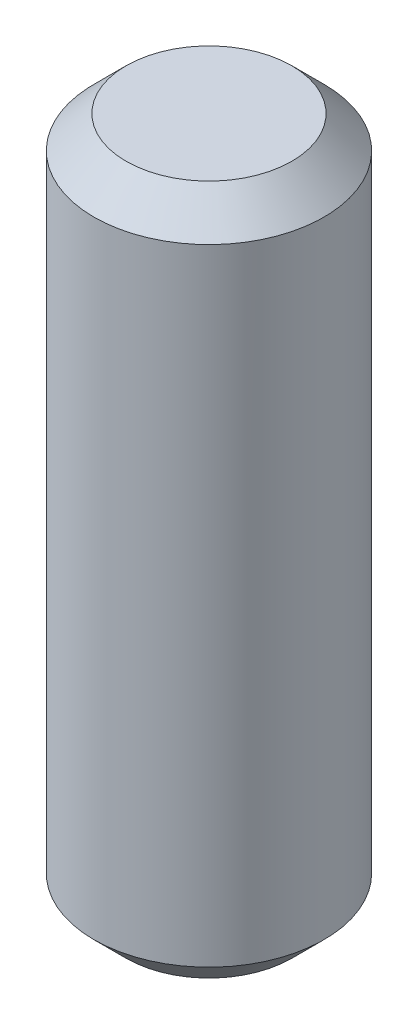
ISO-10303-21;
HEADER;
FILE_DESCRIPTION(('STEP AP214'),'2;1');
FILE_NAME('part.step','',(''),(''),'','','');
FILE_SCHEMA(('AUTOMOTIVE_DESIGN { 1 0 10303 214 1 1 1 1 }'));
ENDSEC;
DATA;
#1=APPLICATION_CONTEXT('core data for automotive mechanical design processes');
#2=APPLICATION_PROTOCOL_DEFINITION('international standard','automotive_design',2000,#1);
#3=PRODUCT_CONTEXT('',#1,'mechanical');
#4=PRODUCT('Part','Part','',(#3));
#5=PRODUCT_RELATED_PRODUCT_CATEGORY('part','',(#4));
#6=PRODUCT_DEFINITION_FORMATION('','',#4);
#7=PRODUCT_DEFINITION_CONTEXT('part definition',#1,'design');
#8=PRODUCT_DEFINITION('design','',#6,#7);
#9=PRODUCT_DEFINITION_SHAPE('','',#8);
#10=(LENGTH_UNIT() NAMED_UNIT(*) SI_UNIT(.MILLI.,.METRE.));
#11=(NAMED_UNIT(*) PLANE_ANGLE_UNIT() SI_UNIT($,.RADIAN.));
#12=(NAMED_UNIT(*) SI_UNIT($,.STERADIAN.) SOLID_ANGLE_UNIT());
#13=UNCERTAINTY_MEASURE_WITH_UNIT(LENGTH_MEASURE(1.E-05),#10,'distance_accuracy_value','');
#14=(GEOMETRIC_REPRESENTATION_CONTEXT(3) GLOBAL_UNCERTAINTY_ASSIGNED_CONTEXT((#13)) GLOBAL_UNIT_ASSIGNED_CONTEXT((#10,
#11,#12)) REPRESENTATION_CONTEXT('',''));
#15=CARTESIAN_POINT('',(0.,0.,0.));
#16=DIRECTION('',(0.,0.,1.));
#17=DIRECTION('',(1.,0.,0.));
#18=AXIS2_PLACEMENT_3D('',#15,#16,#17);
#19=CARTESIAN_POINT('',(0.,0.800000000000002,0.));
#20=DIRECTION('',(0.,1.,0.));
#21=DIRECTION('',(0.,0.,1.));
#22=AXIS2_PLACEMENT_3D('',#19,#20,#21);
#23=CONICAL_SURFACE('',#22,2.6,0.785398163397448);
#24=CARTESIAN_POINT('',(0.,0.,0.));
#25=DIRECTION('',(0.,1.,0.));
#26=DIRECTION('',(0.,0.,1.));
#27=AXIS2_PLACEMENT_3D('',#24,#25,#26);
#28=CIRCLE('',#27,1.8);
#29=CARTESIAN_POINT('',(0.,0.,1.8));
#30=VERTEX_POINT('',#29);
#31=EDGE_CURVE('E48',#30,#30,#28,.F.);
#32=ORIENTED_EDGE('',*,*,#31,.F.);
#33=EDGE_LOOP('',(#32));
#34=FACE_BOUND('',#33,.T.);
#35=CARTESIAN_POINT('',(0.,0.700000000000002,0.));
#36=DIRECTION('',(0.,1.,0.));
#37=DIRECTION('',(0.,0.,1.));
#38=AXIS2_PLACEMENT_3D('',#35,#36,#37);
#39=CIRCLE('',#38,2.5);
#40=CARTESIAN_POINT('',(0.,0.700000000000002,2.5));
#41=VERTEX_POINT('',#40);
#42=EDGE_CURVE('E52',#41,#41,#39,.F.);
#43=ORIENTED_EDGE('',*,*,#42,.T.);
#44=EDGE_LOOP('',(#43));
#45=FACE_BOUND('',#44,.T.);
#46=ADVANCED_FACE('F39',(#34,#45),#23,.T.);
#47=CARTESIAN_POINT('',(0.,0.,0.));
#48=DIRECTION('',(0.,1.,0.));
#49=DIRECTION('',(0.,0.,1.));
#50=AXIS2_PLACEMENT_3D('',#47,#48,#49);
#51=PLANE('',#50);
#52=ORIENTED_EDGE('',*,*,#31,.T.);
#53=EDGE_LOOP('',(#52));
#54=FACE_BOUND('',#53,.T.);
#55=ADVANCED_FACE('F65',(#54),#51,.F.);
#56=CARTESIAN_POINT('',(0.,0.,0.));
#57=DIRECTION('',(0.,1.,0.));
#58=DIRECTION('',(0.,0.,1.));
#59=AXIS2_PLACEMENT_3D('',#56,#57,#58);
#60=CYLINDRICAL_SURFACE('',#59,2.5);
#61=ORIENTED_EDGE('',*,*,#42,.F.);
#62=EDGE_LOOP('',(#61));
#63=FACE_BOUND('',#62,.T.);
#64=CARTESIAN_POINT('',(0.,14.3,0.));
#65=DIRECTION('',(0.,-1.,0.));
#66=DIRECTION('',(0.,0.,-1.));
#67=AXIS2_PLACEMENT_3D('',#64,#65,#66);
#68=CIRCLE('',#67,2.5);
#69=CARTESIAN_POINT('',(0.,14.3,-2.5));
#70=VERTEX_POINT('',#69);
#71=EDGE_CURVE('E44',#70,#70,#68,.F.);
#72=ORIENTED_EDGE('',*,*,#71,.F.);
#73=EDGE_LOOP('',(#72));
#74=FACE_BOUND('',#73,.T.);
#75=ADVANCED_FACE('F62',(#63,#74),#60,.T.);
#76=CARTESIAN_POINT('',(0.,15.,0.));
#77=DIRECTION('',(0.,1.,0.));
#78=DIRECTION('',(0.,0.,1.));
#79=AXIS2_PLACEMENT_3D('',#76,#77,#78);
#80=PLANE('',#79);
#81=CARTESIAN_POINT('',(0.,15.,0.));
#82=DIRECTION('',(0.,1.,0.));
#83=DIRECTION('',(0.,0.,1.));
#84=AXIS2_PLACEMENT_3D('',#81,#82,#83);
#85=CIRCLE('',#84,1.79999999999999);
#86=CARTESIAN_POINT('',(0.,15.,1.79999999999999));
#87=VERTEX_POINT('',#86);
#88=EDGE_CURVE('E10',#87,#87,#85,.T.);
#89=ORIENTED_EDGE('',*,*,#88,.T.);
#90=EDGE_LOOP('',(#89));
#91=FACE_BOUND('',#90,.T.);
#92=ADVANCED_FACE('F64',(#91),#80,.T.);
#93=CARTESIAN_POINT('',(0.,15.,0.));
#94=DIRECTION('',(0.,-1.,0.));
#95=DIRECTION('',(0.,0.,-1.));
#96=AXIS2_PLACEMENT_3D('',#93,#94,#95);
#97=CONICAL_SURFACE('',#96,1.79999999999999,0.785398163397449);
#98=ORIENTED_EDGE('',*,*,#88,.F.);
#99=EDGE_LOOP('',(#98));
#100=FACE_BOUND('',#99,.T.);
#101=ORIENTED_EDGE('',*,*,#71,.T.);
#102=EDGE_LOOP('',(#101));
#103=FACE_BOUND('',#102,.T.);
#104=ADVANCED_FACE('F42',(#100,#103),#97,.T.);
#105=CLOSED_SHELL('',(#46,#55,#75,#92,#104));
#106=MANIFOLD_SOLID_BREP('B2',#105);
#107=ADVANCED_BREP_SHAPE_REPRESENTATION('',(#18,#106),#14);
#108=SHAPE_DEFINITION_REPRESENTATION(#9,#107);
ENDSEC;
END-ISO-10303-21;
